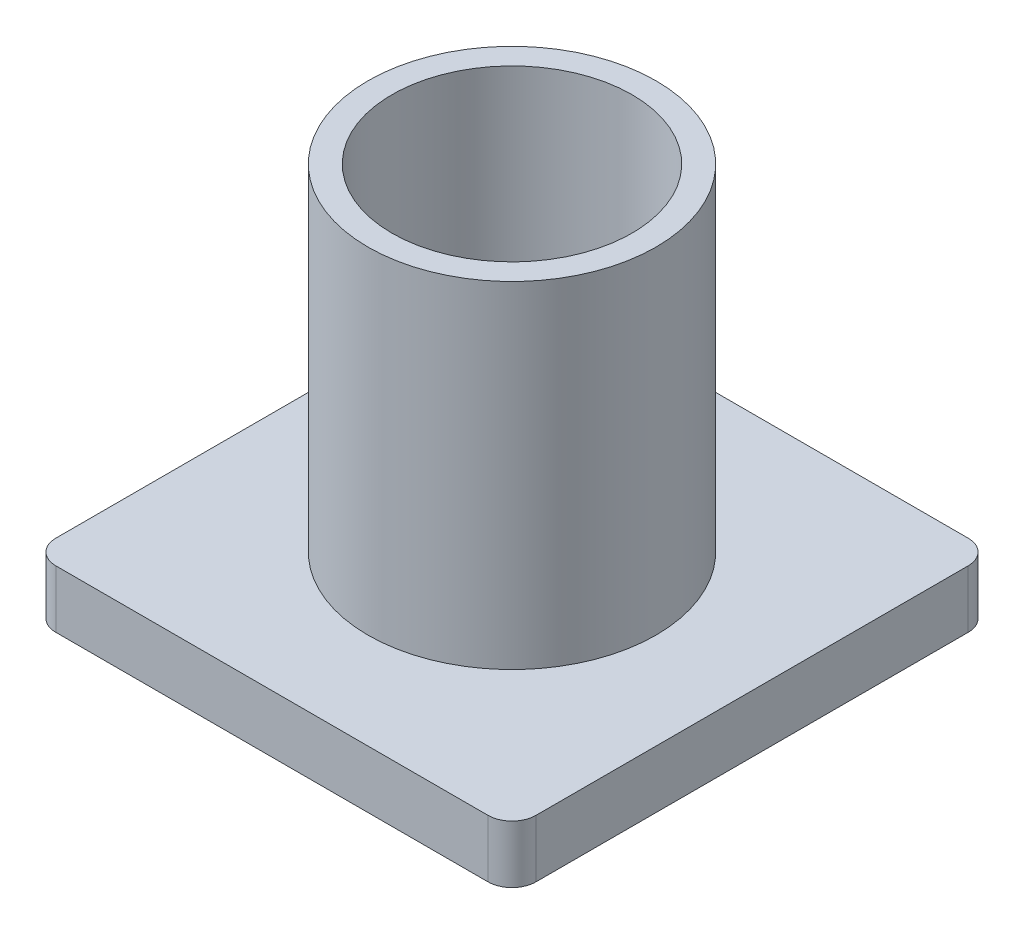
ISO-10303-21;
HEADER;
FILE_DESCRIPTION(('STEP AP214'),'2;1');
FILE_NAME('part.step','',(''),(''),'','','');
FILE_SCHEMA(('AUTOMOTIVE_DESIGN { 1 0 10303 214 1 1 1 1 }'));
ENDSEC;
DATA;
#1=APPLICATION_CONTEXT('core data for automotive mechanical design processes');
#2=APPLICATION_PROTOCOL_DEFINITION('international standard','automotive_design',2000,#1);
#3=PRODUCT_CONTEXT('',#1,'mechanical');
#4=PRODUCT('Part','Part','',(#3));
#5=PRODUCT_RELATED_PRODUCT_CATEGORY('part','',(#4));
#6=PRODUCT_DEFINITION_FORMATION('','',#4);
#7=PRODUCT_DEFINITION_CONTEXT('part definition',#1,'design');
#8=PRODUCT_DEFINITION('design','',#6,#7);
#9=PRODUCT_DEFINITION_SHAPE('','',#8);
#10=(LENGTH_UNIT() NAMED_UNIT(*) SI_UNIT(.MILLI.,.METRE.));
#11=(NAMED_UNIT(*) PLANE_ANGLE_UNIT() SI_UNIT($,.RADIAN.));
#12=(NAMED_UNIT(*) SI_UNIT($,.STERADIAN.) SOLID_ANGLE_UNIT());
#13=UNCERTAINTY_MEASURE_WITH_UNIT(LENGTH_MEASURE(1.E-05),#10,'distance_accuracy_value','');
#14=(GEOMETRIC_REPRESENTATION_CONTEXT(3) GLOBAL_UNCERTAINTY_ASSIGNED_CONTEXT((#13)) GLOBAL_UNIT_ASSIGNED_CONTEXT((#10,
#11,#12)) REPRESENTATION_CONTEXT('',''));
#15=CARTESIAN_POINT('',(0.,0.,0.));
#16=DIRECTION('',(0.,0.,1.));
#17=DIRECTION('',(1.,0.,0.));
#18=AXIS2_PLACEMENT_3D('',#15,#16,#17);
#19=CARTESIAN_POINT('',(-45.,12.,-45.));
#20=DIRECTION('',(0.,-1.,0.));
#21=DIRECTION('',(0.,0.,-1.));
#22=AXIS2_PLACEMENT_3D('',#19,#20,#21);
#23=CYLINDRICAL_SURFACE('',#22,5.);
#24=CARTESIAN_POINT('',(-45.,0.,-45.));
#25=DIRECTION('',(0.,1.,0.));
#26=DIRECTION('',(0.,0.,1.));
#27=AXIS2_PLACEMENT_3D('',#24,#25,#26);
#28=CIRCLE('',#27,5.);
#29=CARTESIAN_POINT('',(-45.,0.,-50.));
#30=VERTEX_POINT('',#29);
#31=CARTESIAN_POINT('',(-50.,0.,-45.));
#32=VERTEX_POINT('',#31);
#33=EDGE_CURVE('E129',#30,#32,#28,.T.);
#34=ORIENTED_EDGE('',*,*,#33,.T.);
#35=DIRECTION('',(0.,-1.,0.));
#36=VECTOR('',#35,1.);
#37=CARTESIAN_POINT('',(-50.,12.,-45.));
#38=LINE('',#37,#36);
#39=CARTESIAN_POINT('',(-50.,12.,-45.));
#40=VERTEX_POINT('',#39);
#41=EDGE_CURVE('E11',#40,#32,#38,.T.);
#42=ORIENTED_EDGE('',*,*,#41,.F.);
#43=CARTESIAN_POINT('',(-45.,12.,-45.));
#44=DIRECTION('',(0.,1.,0.));
#45=DIRECTION('',(0.,0.,1.));
#46=AXIS2_PLACEMENT_3D('',#43,#44,#45);
#47=CIRCLE('',#46,5.);
#48=CARTESIAN_POINT('',(-45.,12.,-50.));
#49=VERTEX_POINT('',#48);
#50=EDGE_CURVE('E144',#49,#40,#47,.T.);
#51=ORIENTED_EDGE('',*,*,#50,.F.);
#52=DIRECTION('',(0.,-1.,0.));
#53=VECTOR('',#52,1.);
#54=CARTESIAN_POINT('',(-45.,12.,-50.));
#55=LINE('',#54,#53);
#56=EDGE_CURVE('E125',#49,#30,#55,.T.);
#57=ORIENTED_EDGE('',*,*,#56,.T.);
#58=EDGE_LOOP('',(#34,#42,#51,#57));
#59=FACE_BOUND('',#58,.T.);
#60=ADVANCED_FACE('F33',(#59),#23,.T.);
#61=CARTESIAN_POINT('',(-50.,12.,-45.));
#62=DIRECTION('',(1.,0.,0.));
#63=DIRECTION('',(0.,0.,-1.));
#64=AXIS2_PLACEMENT_3D('',#61,#62,#63);
#65=PLANE('',#64);
#66=DIRECTION('',(0.,0.,1.));
#67=VECTOR('',#66,1.);
#68=CARTESIAN_POINT('',(-50.,0.,-45.));
#69=LINE('',#68,#67);
#70=CARTESIAN_POINT('',(-50.,0.,45.));
#71=VERTEX_POINT('',#70);
#72=EDGE_CURVE('E132',#32,#71,#69,.T.);
#73=ORIENTED_EDGE('',*,*,#72,.T.);
#74=DIRECTION('',(0.,-1.,0.));
#75=VECTOR('',#74,1.);
#76=CARTESIAN_POINT('',(-50.,12.,45.));
#77=LINE('',#76,#75);
#78=CARTESIAN_POINT('',(-50.,12.,45.));
#79=VERTEX_POINT('',#78);
#80=EDGE_CURVE('E41',#79,#71,#77,.T.);
#81=ORIENTED_EDGE('',*,*,#80,.F.);
#82=DIRECTION('',(0.,0.,1.));
#83=VECTOR('',#82,1.);
#84=CARTESIAN_POINT('',(-50.,12.,-45.));
#85=LINE('',#84,#83);
#86=EDGE_CURVE('E92',#40,#79,#85,.T.);
#87=ORIENTED_EDGE('',*,*,#86,.F.);
#88=ORIENTED_EDGE('',*,*,#41,.T.);
#89=EDGE_LOOP('',(#73,#81,#87,#88));
#90=FACE_BOUND('',#89,.T.);
#91=ADVANCED_FACE('F219',(#90),#65,.F.);
#92=CARTESIAN_POINT('',(-45.,12.,45.));
#93=DIRECTION('',(0.,-1.,0.));
#94=DIRECTION('',(0.,0.,-1.));
#95=AXIS2_PLACEMENT_3D('',#92,#93,#94);
#96=CYLINDRICAL_SURFACE('',#95,5.);
#97=CARTESIAN_POINT('',(-45.,0.,45.));
#98=DIRECTION('',(0.,1.,0.));
#99=DIRECTION('',(0.,0.,1.));
#100=AXIS2_PLACEMENT_3D('',#97,#98,#99);
#101=CIRCLE('',#100,5.);
#102=CARTESIAN_POINT('',(-45.,0.,50.));
#103=VERTEX_POINT('',#102);
#104=EDGE_CURVE('E135',#71,#103,#101,.T.);
#105=ORIENTED_EDGE('',*,*,#104,.T.);
#106=DIRECTION('',(0.,-1.,0.));
#107=VECTOR('',#106,1.);
#108=CARTESIAN_POINT('',(-45.,12.,50.));
#109=LINE('',#108,#107);
#110=CARTESIAN_POINT('',(-45.,12.,50.));
#111=VERTEX_POINT('',#110);
#112=EDGE_CURVE('E151',#111,#103,#109,.T.);
#113=ORIENTED_EDGE('',*,*,#112,.F.);
#114=CARTESIAN_POINT('',(-45.,12.,45.));
#115=DIRECTION('',(0.,1.,0.));
#116=DIRECTION('',(0.,0.,1.));
#117=AXIS2_PLACEMENT_3D('',#114,#115,#116);
#118=CIRCLE('',#117,5.);
#119=EDGE_CURVE('E159',#79,#111,#118,.T.);
#120=ORIENTED_EDGE('',*,*,#119,.F.);
#121=ORIENTED_EDGE('',*,*,#80,.T.);
#122=EDGE_LOOP('',(#105,#113,#120,#121));
#123=FACE_BOUND('',#122,.T.);
#124=ADVANCED_FACE('F157',(#123),#96,.T.);
#125=CARTESIAN_POINT('',(-45.,12.,50.));
#126=DIRECTION('',(0.,0.,-1.));
#127=DIRECTION('',(-1.,0.,0.));
#128=AXIS2_PLACEMENT_3D('',#125,#126,#127);
#129=PLANE('',#128);
#130=DIRECTION('',(1.,0.,0.));
#131=VECTOR('',#130,1.);
#132=CARTESIAN_POINT('',(-45.,0.,50.));
#133=LINE('',#132,#131);
#134=CARTESIAN_POINT('',(45.,0.,50.));
#135=VERTEX_POINT('',#134);
#136=EDGE_CURVE('E137',#103,#135,#133,.T.);
#137=ORIENTED_EDGE('',*,*,#136,.T.);
#138=DIRECTION('',(0.,-1.,0.));
#139=VECTOR('',#138,1.);
#140=CARTESIAN_POINT('',(45.,12.,50.));
#141=LINE('',#140,#139);
#142=CARTESIAN_POINT('',(45.,12.,50.));
#143=VERTEX_POINT('',#142);
#144=EDGE_CURVE('E148',#143,#135,#141,.T.);
#145=ORIENTED_EDGE('',*,*,#144,.F.);
#146=DIRECTION('',(1.,0.,0.));
#147=VECTOR('',#146,1.);
#148=CARTESIAN_POINT('',(-45.,12.,50.));
#149=LINE('',#148,#147);
#150=EDGE_CURVE('E171',#111,#143,#149,.T.);
#151=ORIENTED_EDGE('',*,*,#150,.F.);
#152=ORIENTED_EDGE('',*,*,#112,.T.);
#153=EDGE_LOOP('',(#137,#145,#151,#152));
#154=FACE_BOUND('',#153,.T.);
#155=ADVANCED_FACE('F167',(#154),#129,.F.);
#156=CARTESIAN_POINT('',(45.,12.,45.));
#157=DIRECTION('',(0.,-1.,0.));
#158=DIRECTION('',(0.,0.,-1.));
#159=AXIS2_PLACEMENT_3D('',#156,#157,#158);
#160=CYLINDRICAL_SURFACE('',#159,4.99999999999999);
#161=CARTESIAN_POINT('',(45.,0.,45.));
#162=DIRECTION('',(0.,1.,0.));
#163=DIRECTION('',(0.,0.,1.));
#164=AXIS2_PLACEMENT_3D('',#161,#162,#163);
#165=CIRCLE('',#164,4.99999999999999);
#166=CARTESIAN_POINT('',(50.,0.,45.));
#167=VERTEX_POINT('',#166);
#168=EDGE_CURVE('E139',#135,#167,#165,.T.);
#169=ORIENTED_EDGE('',*,*,#168,.T.);
#170=DIRECTION('',(0.,-1.,0.));
#171=VECTOR('',#170,1.);
#172=CARTESIAN_POINT('',(50.,12.,45.));
#173=LINE('',#172,#171);
#174=CARTESIAN_POINT('',(50.,12.,45.));
#175=VERTEX_POINT('',#174);
#176=EDGE_CURVE('E120',#175,#167,#173,.T.);
#177=ORIENTED_EDGE('',*,*,#176,.F.);
#178=CARTESIAN_POINT('',(45.,12.,45.));
#179=DIRECTION('',(0.,1.,0.));
#180=DIRECTION('',(0.,0.,1.));
#181=AXIS2_PLACEMENT_3D('',#178,#179,#180);
#182=CIRCLE('',#181,4.99999999999999);
#183=EDGE_CURVE('E111',#143,#175,#182,.T.);
#184=ORIENTED_EDGE('',*,*,#183,.F.);
#185=ORIENTED_EDGE('',*,*,#144,.T.);
#186=EDGE_LOOP('',(#169,#177,#184,#185));
#187=FACE_BOUND('',#186,.T.);
#188=ADVANCED_FACE('F170',(#187),#160,.T.);
#189=CARTESIAN_POINT('',(50.,12.,-45.));
#190=DIRECTION('',(-1.,0.,0.));
#191=DIRECTION('',(0.,0.,1.));
#192=AXIS2_PLACEMENT_3D('',#189,#190,#191);
#193=PLANE('',#192);
#194=DIRECTION('',(0.,0.,-1.));
#195=VECTOR('',#194,1.);
#196=CARTESIAN_POINT('',(50.,0.,-45.));
#197=LINE('',#196,#195);
#198=CARTESIAN_POINT('',(50.,0.,-45.));
#199=VERTEX_POINT('',#198);
#200=EDGE_CURVE('E119',#167,#199,#197,.T.);
#201=ORIENTED_EDGE('',*,*,#200,.T.);
#202=DIRECTION('',(0.,-1.,0.));
#203=VECTOR('',#202,1.);
#204=CARTESIAN_POINT('',(50.,12.,-45.));
#205=LINE('',#204,#203);
#206=CARTESIAN_POINT('',(50.,12.,-45.));
#207=VERTEX_POINT('',#206);
#208=EDGE_CURVE('E116',#207,#199,#205,.T.);
#209=ORIENTED_EDGE('',*,*,#208,.F.);
#210=DIRECTION('',(0.,0.,-1.));
#211=VECTOR('',#210,1.);
#212=CARTESIAN_POINT('',(50.,12.,-45.));
#213=LINE('',#212,#211);
#214=EDGE_CURVE('E105',#175,#207,#213,.T.);
#215=ORIENTED_EDGE('',*,*,#214,.F.);
#216=ORIENTED_EDGE('',*,*,#176,.T.);
#217=EDGE_LOOP('',(#201,#209,#215,#216));
#218=FACE_BOUND('',#217,.T.);
#219=ADVANCED_FACE('F117',(#218),#193,.F.);
#220=CARTESIAN_POINT('',(45.,12.,-45.));
#221=DIRECTION('',(0.,-1.,0.));
#222=DIRECTION('',(0.,0.,-1.));
#223=AXIS2_PLACEMENT_3D('',#220,#221,#222);
#224=CYLINDRICAL_SURFACE('',#223,5.);
#225=CARTESIAN_POINT('',(45.,0.,-45.));
#226=DIRECTION('',(0.,1.,0.));
#227=DIRECTION('',(0.,0.,-1.));
#228=AXIS2_PLACEMENT_3D('',#225,#226,#227);
#229=CIRCLE('',#228,5.);
#230=CARTESIAN_POINT('',(45.,0.,-50.));
#231=VERTEX_POINT('',#230);
#232=EDGE_CURVE('E78',#199,#231,#229,.T.);
#233=ORIENTED_EDGE('',*,*,#232,.T.);
#234=DIRECTION('',(0.,-1.,0.));
#235=VECTOR('',#234,1.);
#236=CARTESIAN_POINT('',(45.,12.,-50.));
#237=LINE('',#236,#235);
#238=CARTESIAN_POINT('',(45.,12.,-50.));
#239=VERTEX_POINT('',#238);
#240=EDGE_CURVE('E121',#239,#231,#237,.T.);
#241=ORIENTED_EDGE('',*,*,#240,.F.);
#242=CARTESIAN_POINT('',(45.,12.,-45.));
#243=DIRECTION('',(0.,1.,0.));
#244=DIRECTION('',(0.,0.,-1.));
#245=AXIS2_PLACEMENT_3D('',#242,#243,#244);
#246=CIRCLE('',#245,5.);
#247=EDGE_CURVE('E109',#207,#239,#246,.T.);
#248=ORIENTED_EDGE('',*,*,#247,.F.);
#249=ORIENTED_EDGE('',*,*,#208,.T.);
#250=EDGE_LOOP('',(#233,#241,#248,#249));
#251=FACE_BOUND('',#250,.T.);
#252=ADVANCED_FACE('F123',(#251),#224,.T.);
#253=CARTESIAN_POINT('',(-45.,12.,-50.));
#254=DIRECTION('',(0.,0.,1.));
#255=DIRECTION('',(1.,0.,0.));
#256=AXIS2_PLACEMENT_3D('',#253,#254,#255);
#257=PLANE('',#256);
#258=DIRECTION('',(-1.,0.,0.));
#259=VECTOR('',#258,1.);
#260=CARTESIAN_POINT('',(-45.,0.,-50.));
#261=LINE('',#260,#259);
#262=EDGE_CURVE('E84',#231,#30,#261,.T.);
#263=ORIENTED_EDGE('',*,*,#262,.T.);
#264=ORIENTED_EDGE('',*,*,#56,.F.);
#265=DIRECTION('',(-1.,0.,0.));
#266=VECTOR('',#265,1.);
#267=CARTESIAN_POINT('',(-45.,12.,-50.));
#268=LINE('',#267,#266);
#269=EDGE_CURVE('E49',#239,#49,#268,.T.);
#270=ORIENTED_EDGE('',*,*,#269,.F.);
#271=ORIENTED_EDGE('',*,*,#240,.T.);
#272=EDGE_LOOP('',(#263,#264,#270,#271));
#273=FACE_BOUND('',#272,.T.);
#274=ADVANCED_FACE('F210',(#273),#257,.F.);
#275=CARTESIAN_POINT('',(-45.,12.,-45.));
#276=DIRECTION('',(0.,1.,0.));
#277=DIRECTION('',(0.,0.,1.));
#278=AXIS2_PLACEMENT_3D('',#275,#276,#277);
#279=PLANE('',#278);
#280=CARTESIAN_POINT('',(0.,12.,0.));
#281=DIRECTION('',(0.,1.,0.));
#282=DIRECTION('',(0.,0.,1.));
#283=AXIS2_PLACEMENT_3D('',#280,#281,#282);
#284=CIRCLE('',#283,30.);
#285=CARTESIAN_POINT('',(0.,12.,30.));
#286=VERTEX_POINT('',#285);
#287=EDGE_CURVE('E177',#286,#286,#284,.T.);
#288=ORIENTED_EDGE('',*,*,#287,.F.);
#289=EDGE_LOOP('',(#288));
#290=FACE_BOUND('',#289,.T.);
#291=ORIENTED_EDGE('',*,*,#50,.T.);
#292=ORIENTED_EDGE('',*,*,#86,.T.);
#293=ORIENTED_EDGE('',*,*,#119,.T.);
#294=ORIENTED_EDGE('',*,*,#150,.T.);
#295=ORIENTED_EDGE('',*,*,#183,.T.);
#296=ORIENTED_EDGE('',*,*,#214,.T.);
#297=ORIENTED_EDGE('',*,*,#247,.T.);
#298=ORIENTED_EDGE('',*,*,#269,.T.);
#299=EDGE_LOOP('',(#291,#292,#293,#294,#295,#296,#297,#298));
#300=FACE_BOUND('',#299,.T.);
#301=ADVANCED_FACE('F107',(#290,#300),#279,.T.);
#302=CARTESIAN_POINT('',(-45.,0.,-45.));
#303=DIRECTION('',(0.,1.,0.));
#304=DIRECTION('',(0.,0.,1.));
#305=AXIS2_PLACEMENT_3D('',#302,#303,#304);
#306=PLANE('',#305);
#307=ORIENTED_EDGE('',*,*,#33,.F.);
#308=ORIENTED_EDGE('',*,*,#262,.F.);
#309=ORIENTED_EDGE('',*,*,#232,.F.);
#310=ORIENTED_EDGE('',*,*,#200,.F.);
#311=ORIENTED_EDGE('',*,*,#168,.F.);
#312=ORIENTED_EDGE('',*,*,#136,.F.);
#313=ORIENTED_EDGE('',*,*,#104,.F.);
#314=ORIENTED_EDGE('',*,*,#72,.F.);
#315=EDGE_LOOP('',(#307,#308,#309,#310,#311,#312,#313,#314));
#316=FACE_BOUND('',#315,.T.);
#317=ADVANCED_FACE('F163',(#316),#306,.F.);
#318=CARTESIAN_POINT('',(0.,82.,0.));
#319=DIRECTION('',(0.,-1.,0.));
#320=DIRECTION('',(0.,0.,-1.));
#321=AXIS2_PLACEMENT_3D('',#318,#319,#320);
#322=CYLINDRICAL_SURFACE('',#321,30.);
#323=CARTESIAN_POINT('',(0.,82.,0.));
#324=DIRECTION('',(0.,1.,0.));
#325=DIRECTION('',(0.,0.,1.));
#326=AXIS2_PLACEMENT_3D('',#323,#324,#325);
#327=CIRCLE('',#326,30.);
#328=CARTESIAN_POINT('',(0.,82.,30.));
#329=VERTEX_POINT('',#328);
#330=EDGE_CURVE('E133',#329,#329,#327,.T.);
#331=ORIENTED_EDGE('',*,*,#330,.F.);
#332=EDGE_LOOP('',(#331));
#333=FACE_BOUND('',#332,.T.);
#334=ORIENTED_EDGE('',*,*,#287,.T.);
#335=EDGE_LOOP('',(#334));
#336=FACE_BOUND('',#335,.T.);
#337=ADVANCED_FACE('F200',(#333,#336),#322,.T.);
#338=CARTESIAN_POINT('',(0.,82.,0.));
#339=DIRECTION('',(0.,1.,0.));
#340=DIRECTION('',(0.,0.,1.));
#341=AXIS2_PLACEMENT_3D('',#338,#339,#340);
#342=PLANE('',#341);
#343=CARTESIAN_POINT('',(0.,82.,0.));
#344=DIRECTION('',(0.,1.,0.));
#345=DIRECTION('',(0.,0.,1.));
#346=AXIS2_PLACEMENT_3D('',#343,#344,#345);
#347=CIRCLE('',#346,25.);
#348=CARTESIAN_POINT('',(0.,82.,25.));
#349=VERTEX_POINT('',#348);
#350=EDGE_CURVE('E183',#349,#349,#347,.T.);
#351=ORIENTED_EDGE('',*,*,#350,.F.);
#352=EDGE_LOOP('',(#351));
#353=FACE_BOUND('',#352,.T.);
#354=ORIENTED_EDGE('',*,*,#330,.T.);
#355=EDGE_LOOP('',(#354));
#356=FACE_BOUND('',#355,.T.);
#357=ADVANCED_FACE('F194',(#353,#356),#342,.T.);
#358=CARTESIAN_POINT('',(0.,12.,0.));
#359=DIRECTION('',(0.,1.,0.));
#360=DIRECTION('',(0.,0.,1.));
#361=AXIS2_PLACEMENT_3D('',#358,#359,#360);
#362=CYLINDRICAL_SURFACE('',#361,25.);
#363=CARTESIAN_POINT('',(0.,12.,0.));
#364=DIRECTION('',(0.,1.,0.));
#365=DIRECTION('',(0.,0.,1.));
#366=AXIS2_PLACEMENT_3D('',#363,#364,#365);
#367=CIRCLE('',#366,25.);
#368=CARTESIAN_POINT('',(0.,12.,25.));
#369=VERTEX_POINT('',#368);
#370=EDGE_CURVE('E180',#369,#369,#367,.T.);
#371=ORIENTED_EDGE('',*,*,#370,.F.);
#372=EDGE_LOOP('',(#371));
#373=FACE_BOUND('',#372,.T.);
#374=ORIENTED_EDGE('',*,*,#350,.T.);
#375=EDGE_LOOP('',(#374));
#376=FACE_BOUND('',#375,.T.);
#377=ADVANCED_FACE('F191',(#373,#376),#362,.F.);
#378=CARTESIAN_POINT('',(0.,12.,0.));
#379=DIRECTION('',(0.,1.,0.));
#380=DIRECTION('',(0.,0.,1.));
#381=AXIS2_PLACEMENT_3D('',#378,#379,#380);
#382=PLANE('',#381);
#383=ORIENTED_EDGE('',*,*,#370,.T.);
#384=EDGE_LOOP('',(#383));
#385=FACE_BOUND('',#384,.T.);
#386=ADVANCED_FACE('F189',(#385),#382,.T.);
#387=CLOSED_SHELL('',(#60,#91,#124,#155,#188,#219,#252,#274,#301,#317,#337,#357,#377,#386));
#388=MANIFOLD_SOLID_BREP('B2',#387);
#389=ADVANCED_BREP_SHAPE_REPRESENTATION('',(#18,#388),#14);
#390=SHAPE_DEFINITION_REPRESENTATION(#9,#389);
ENDSEC;
END-ISO-10303-21;
